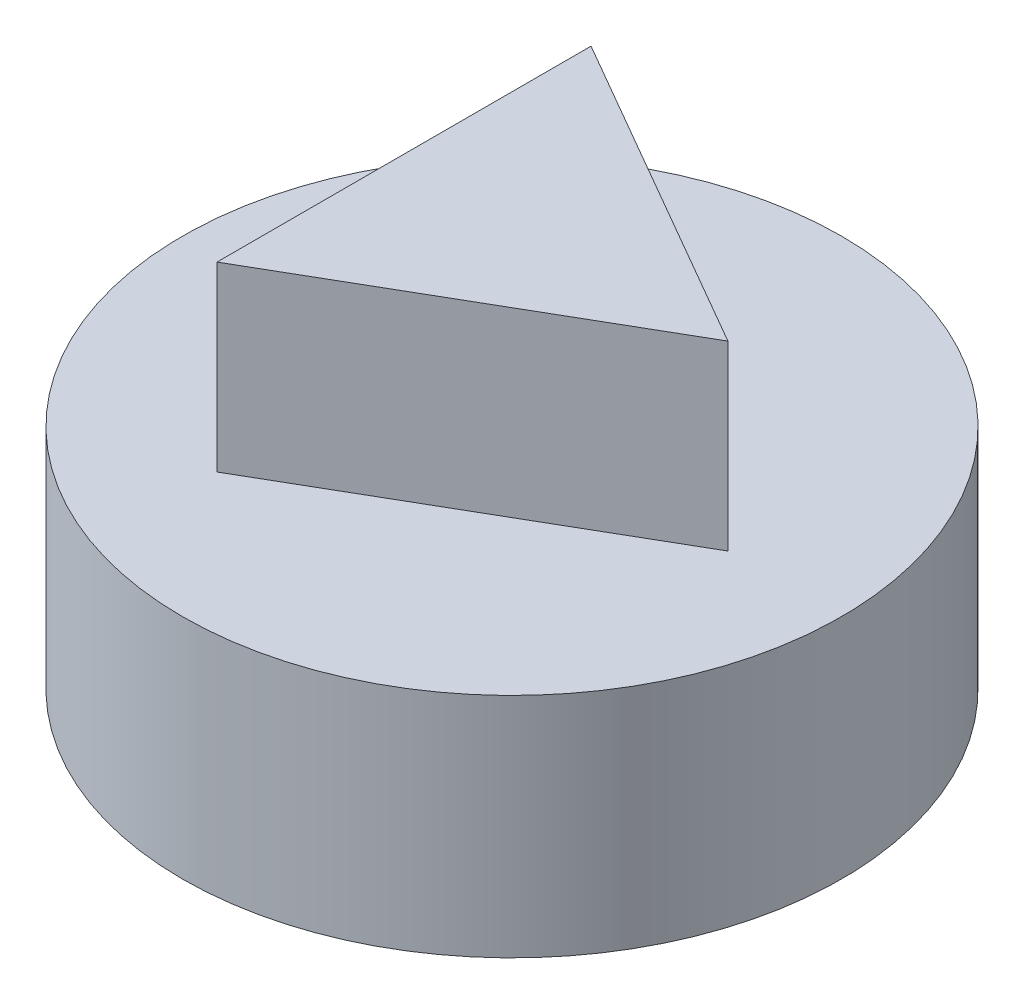
ISO-10303-21;
HEADER;
FILE_DESCRIPTION(('STEP AP214'),'2;1');
FILE_NAME('part.step','',(''),(''),'','','');
FILE_SCHEMA(('AUTOMOTIVE_DESIGN { 1 0 10303 214 1 1 1 1 }'));
ENDSEC;
DATA;
#1=APPLICATION_CONTEXT('core data for automotive mechanical design processes');
#2=APPLICATION_PROTOCOL_DEFINITION('international standard','automotive_design',2000,#1);
#3=PRODUCT_CONTEXT('',#1,'mechanical');
#4=PRODUCT('Part','Part','',(#3));
#5=PRODUCT_RELATED_PRODUCT_CATEGORY('part','',(#4));
#6=PRODUCT_DEFINITION_FORMATION('','',#4);
#7=PRODUCT_DEFINITION_CONTEXT('part definition',#1,'design');
#8=PRODUCT_DEFINITION('design','',#6,#7);
#9=PRODUCT_DEFINITION_SHAPE('','',#8);
#10=(LENGTH_UNIT() NAMED_UNIT(*) SI_UNIT(.MILLI.,.METRE.));
#11=(NAMED_UNIT(*) PLANE_ANGLE_UNIT() SI_UNIT($,.RADIAN.));
#12=(NAMED_UNIT(*) SI_UNIT($,.STERADIAN.) SOLID_ANGLE_UNIT());
#13=UNCERTAINTY_MEASURE_WITH_UNIT(LENGTH_MEASURE(1.E-05),#10,'distance_accuracy_value','');
#14=(GEOMETRIC_REPRESENTATION_CONTEXT(3) GLOBAL_UNCERTAINTY_ASSIGNED_CONTEXT((#13)) GLOBAL_UNIT_ASSIGNED_CONTEXT((#10,
#11,#12)) REPRESENTATION_CONTEXT('',''));
#15=CARTESIAN_POINT('',(0.,0.,0.));
#16=DIRECTION('',(0.,0.,1.));
#17=DIRECTION('',(1.,0.,0.));
#18=AXIS2_PLACEMENT_3D('',#15,#16,#17);
#19=CARTESIAN_POINT('',(0.,5.,0.));
#20=DIRECTION('',(0.,-1.,0.));
#21=DIRECTION('',(0.,0.,-1.));
#22=AXIS2_PLACEMENT_3D('',#19,#20,#21);
#23=CYLINDRICAL_SURFACE('',#22,7.25);
#24=CARTESIAN_POINT('',(0.,5.,0.));
#25=DIRECTION('',(0.,1.,0.));
#26=DIRECTION('',(0.,0.,1.));
#27=AXIS2_PLACEMENT_3D('',#24,#25,#26);
#28=CIRCLE('',#27,7.25);
#29=CARTESIAN_POINT('',(0.,5.,7.25));
#30=VERTEX_POINT('',#29);
#31=EDGE_CURVE('E11',#30,#30,#28,.T.);
#32=ORIENTED_EDGE('',*,*,#31,.F.);
#33=EDGE_LOOP('',(#32));
#34=FACE_BOUND('',#33,.T.);
#35=CARTESIAN_POINT('',(0.,0.,0.));
#36=DIRECTION('',(0.,1.,0.));
#37=DIRECTION('',(0.,0.,1.));
#38=AXIS2_PLACEMENT_3D('',#35,#36,#37);
#39=CIRCLE('',#38,7.25);
#40=CARTESIAN_POINT('',(0.,0.,7.25));
#41=VERTEX_POINT('',#40);
#42=EDGE_CURVE('E36',#41,#41,#39,.T.);
#43=ORIENTED_EDGE('',*,*,#42,.T.);
#44=EDGE_LOOP('',(#43));
#45=FACE_BOUND('',#44,.T.);
#46=ADVANCED_FACE('F33',(#34,#45),#23,.T.);
#47=CARTESIAN_POINT('',(0.,5.,0.));
#48=DIRECTION('',(0.,1.,0.));
#49=DIRECTION('',(0.,0.,1.));
#50=AXIS2_PLACEMENT_3D('',#47,#48,#49);
#51=PLANE('',#50);
#52=DIRECTION('',(0.866025403784439,0.,-0.5));
#53=VECTOR('',#52,1.);
#54=CARTESIAN_POINT('',(-2.37500000000001,5.,4.1136206679761));
#55=LINE('',#54,#53);
#56=CARTESIAN_POINT('',(-2.37500000000001,5.,4.1136206679761));
#57=VERTEX_POINT('',#56);
#58=CARTESIAN_POINT('',(4.75000000000002,5.,0.));
#59=VERTEX_POINT('',#58);
#60=EDGE_CURVE('E47',#57,#59,#55,.T.);
#61=ORIENTED_EDGE('',*,*,#60,.F.);
#62=DIRECTION('',(0.,0.,1.));
#63=VECTOR('',#62,1.);
#64=CARTESIAN_POINT('',(-2.37500000000001,5.,-4.1136206679761));
#65=LINE('',#64,#63);
#66=CARTESIAN_POINT('',(-2.37500000000001,5.,-4.1136206679761));
#67=VERTEX_POINT('',#66);
#68=EDGE_CURVE('E82',#67,#57,#65,.T.);
#69=ORIENTED_EDGE('',*,*,#68,.F.);
#70=DIRECTION('',(-0.866025403784439,0.,-0.5));
#71=VECTOR('',#70,1.);
#72=CARTESIAN_POINT('',(4.75000000000002,5.,0.));
#73=LINE('',#72,#71);
#74=EDGE_CURVE('E51',#59,#67,#73,.T.);
#75=ORIENTED_EDGE('',*,*,#74,.F.);
#76=EDGE_LOOP('',(#61,#69,#75));
#77=FACE_BOUND('',#76,.T.);
#78=ORIENTED_EDGE('',*,*,#31,.T.);
#79=EDGE_LOOP('',(#78));
#80=FACE_BOUND('',#79,.T.);
#81=ADVANCED_FACE('F96',(#77,#80),#51,.T.);
#82=CARTESIAN_POINT('',(0.,0.,0.));
#83=DIRECTION('',(0.,1.,0.));
#84=DIRECTION('',(0.,0.,1.));
#85=AXIS2_PLACEMENT_3D('',#82,#83,#84);
#86=PLANE('',#85);
#87=ORIENTED_EDGE('',*,*,#42,.F.);
#88=EDGE_LOOP('',(#87));
#89=FACE_BOUND('',#88,.T.);
#90=ADVANCED_FACE('F99',(#89),#86,.F.);
#91=CARTESIAN_POINT('',(-2.37500000000001,9.,4.1136206679761));
#92=DIRECTION('',(-0.5,0.,-0.866025403784438));
#93=DIRECTION('',(-0.866025403784439,0.,0.5));
#94=AXIS2_PLACEMENT_3D('',#91,#92,#93);
#95=PLANE('',#94);
#96=ORIENTED_EDGE('',*,*,#60,.T.);
#97=DIRECTION('',(0.,-1.,0.));
#98=VECTOR('',#97,1.);
#99=CARTESIAN_POINT('',(4.75000000000002,9.,0.));
#100=LINE('',#99,#98);
#101=CARTESIAN_POINT('',(4.75000000000002,9.,0.));
#102=VERTEX_POINT('',#101);
#103=EDGE_CURVE('E69',#102,#59,#100,.T.);
#104=ORIENTED_EDGE('',*,*,#103,.F.);
#105=DIRECTION('',(0.866025403784439,0.,-0.5));
#106=VECTOR('',#105,1.);
#107=CARTESIAN_POINT('',(-2.37500000000001,9.,4.1136206679761));
#108=LINE('',#107,#106);
#109=CARTESIAN_POINT('',(-2.37500000000001,9.,4.1136206679761));
#110=VERTEX_POINT('',#109);
#111=EDGE_CURVE('E75',#110,#102,#108,.T.);
#112=ORIENTED_EDGE('',*,*,#111,.F.);
#113=DIRECTION('',(0.,-1.,0.));
#114=VECTOR('',#113,1.);
#115=CARTESIAN_POINT('',(-2.37500000000001,9.,4.1136206679761));
#116=LINE('',#115,#114);
#117=EDGE_CURVE('E87',#110,#57,#116,.T.);
#118=ORIENTED_EDGE('',*,*,#117,.T.);
#119=EDGE_LOOP('',(#96,#104,#112,#118));
#120=FACE_BOUND('',#119,.T.);
#121=ADVANCED_FACE('F84',(#120),#95,.F.);
#122=CARTESIAN_POINT('',(4.75000000000002,9.,0.));
#123=DIRECTION('',(-0.5,0.,0.866025403784439));
#124=DIRECTION('',(0.866025403784439,0.,0.5));
#125=AXIS2_PLACEMENT_3D('',#122,#123,#124);
#126=PLANE('',#125);
#127=ORIENTED_EDGE('',*,*,#74,.T.);
#128=DIRECTION('',(0.,-1.,0.));
#129=VECTOR('',#128,1.);
#130=CARTESIAN_POINT('',(-2.37500000000001,9.,-4.1136206679761));
#131=LINE('',#130,#129);
#132=CARTESIAN_POINT('',(-2.37500000000001,9.,-4.1136206679761));
#133=VERTEX_POINT('',#132);
#134=EDGE_CURVE('E71',#133,#67,#131,.T.);
#135=ORIENTED_EDGE('',*,*,#134,.F.);
#136=DIRECTION('',(-0.866025403784439,0.,-0.5));
#137=VECTOR('',#136,1.);
#138=CARTESIAN_POINT('',(4.75000000000002,9.,0.));
#139=LINE('',#138,#137);
#140=EDGE_CURVE('E65',#102,#133,#139,.T.);
#141=ORIENTED_EDGE('',*,*,#140,.F.);
#142=ORIENTED_EDGE('',*,*,#103,.T.);
#143=EDGE_LOOP('',(#127,#135,#141,#142));
#144=FACE_BOUND('',#143,.T.);
#145=ADVANCED_FACE('F67',(#144),#126,.F.);
#146=CARTESIAN_POINT('',(-2.37500000000001,9.,-4.1136206679761));
#147=DIRECTION('',(1.,0.,0.));
#148=DIRECTION('',(0.,0.,-1.));
#149=AXIS2_PLACEMENT_3D('',#146,#147,#148);
#150=PLANE('',#149);
#151=ORIENTED_EDGE('',*,*,#68,.T.);
#152=ORIENTED_EDGE('',*,*,#117,.F.);
#153=DIRECTION('',(0.,0.,1.));
#154=VECTOR('',#153,1.);
#155=CARTESIAN_POINT('',(-2.37500000000001,9.,-4.1136206679761));
#156=LINE('',#155,#154);
#157=EDGE_CURVE('E74',#133,#110,#156,.T.);
#158=ORIENTED_EDGE('',*,*,#157,.F.);
#159=ORIENTED_EDGE('',*,*,#134,.T.);
#160=EDGE_LOOP('',(#151,#152,#158,#159));
#161=FACE_BOUND('',#160,.T.);
#162=ADVANCED_FACE('F95',(#161),#150,.F.);
#163=CARTESIAN_POINT('',(0.,9.,0.));
#164=DIRECTION('',(0.,1.,0.));
#165=DIRECTION('',(0.,0.,1.));
#166=AXIS2_PLACEMENT_3D('',#163,#164,#165);
#167=PLANE('',#166);
#168=ORIENTED_EDGE('',*,*,#111,.T.);
#169=ORIENTED_EDGE('',*,*,#140,.T.);
#170=ORIENTED_EDGE('',*,*,#157,.T.);
#171=EDGE_LOOP('',(#168,#169,#170));
#172=FACE_BOUND('',#171,.T.);
#173=ADVANCED_FACE('F78',(#172),#167,.T.);
#174=CLOSED_SHELL('',(#46,#81,#90,#121,#145,#162,#173));
#175=MANIFOLD_SOLID_BREP('B2',#174);
#176=ADVANCED_BREP_SHAPE_REPRESENTATION('',(#18,#175),#14);
#177=SHAPE_DEFINITION_REPRESENTATION(#9,#176);
ENDSEC;
END-ISO-10303-21;
